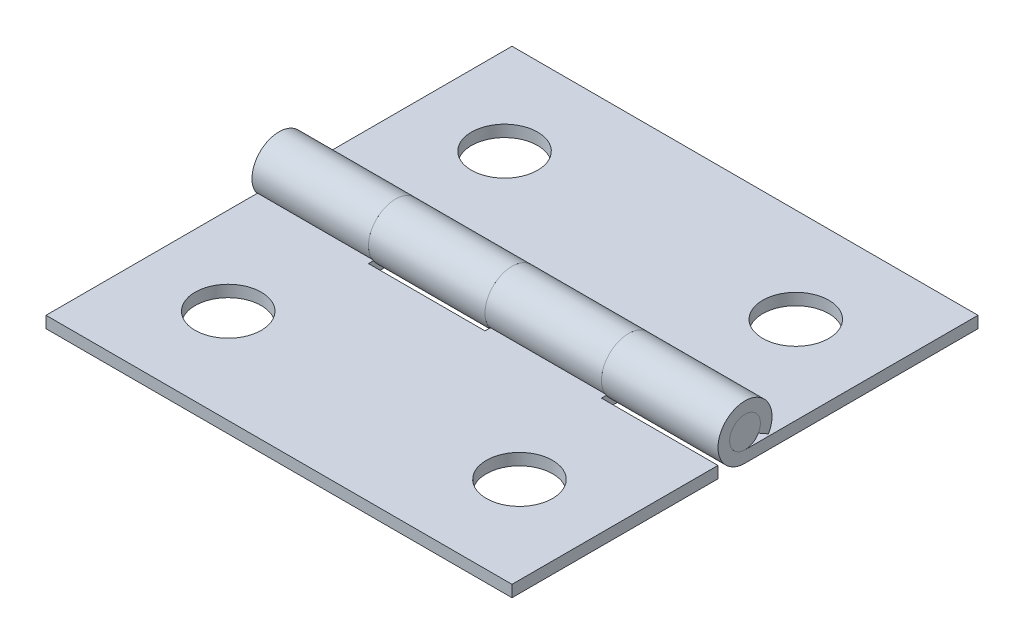
ISO-10303-21;
HEADER;
FILE_DESCRIPTION(('STEP AP214'),'2;1');
FILE_NAME('part.step','',(''),(''),'','','');
FILE_SCHEMA(('AUTOMOTIVE_DESIGN { 1 0 10303 214 1 1 1 1 }'));
ENDSEC;
DATA;
#1=APPLICATION_CONTEXT('core data for automotive mechanical design processes');
#2=APPLICATION_PROTOCOL_DEFINITION('international standard','automotive_design',2000,#1);
#3=PRODUCT_CONTEXT('',#1,'mechanical');
#4=PRODUCT('Part','Part','',(#3));
#5=PRODUCT_RELATED_PRODUCT_CATEGORY('part','',(#4));
#6=PRODUCT_DEFINITION_FORMATION('','',#4);
#7=PRODUCT_DEFINITION_CONTEXT('part definition',#1,'design');
#8=PRODUCT_DEFINITION('design','',#6,#7);
#9=PRODUCT_DEFINITION_SHAPE('','',#8);
#10=(LENGTH_UNIT() NAMED_UNIT(*) SI_UNIT(.MILLI.,.METRE.));
#11=(NAMED_UNIT(*) PLANE_ANGLE_UNIT() SI_UNIT($,.RADIAN.));
#12=(NAMED_UNIT(*) SI_UNIT($,.STERADIAN.) SOLID_ANGLE_UNIT());
#13=UNCERTAINTY_MEASURE_WITH_UNIT(LENGTH_MEASURE(1.E-05),#10,'distance_accuracy_value','');
#14=(GEOMETRIC_REPRESENTATION_CONTEXT(3) GLOBAL_UNCERTAINTY_ASSIGNED_CONTEXT((#13)) GLOBAL_UNIT_ASSIGNED_CONTEXT((#10,
#11,#12)) REPRESENTATION_CONTEXT('',''));
#15=CARTESIAN_POINT('',(0.,0.,0.));
#16=DIRECTION('',(0.,0.,1.));
#17=DIRECTION('',(1.,0.,0.));
#18=AXIS2_PLACEMENT_3D('',#15,#16,#17);
#19=CARTESIAN_POINT('',(12.7,0.,0.));
#20=DIRECTION('',(-1.,0.,0.));
#21=DIRECTION('',(0.,0.,1.));
#22=AXIS2_PLACEMENT_3D('',#19,#20,#21);
#23=CYLINDRICAL_SURFACE('',#22,0.8382);
#24=CARTESIAN_POINT('',(12.7,0.,0.));
#25=DIRECTION('',(1.,0.,0.));
#26=DIRECTION('',(0.,0.,-1.));
#27=AXIS2_PLACEMENT_3D('',#24,#25,#26);
#28=CIRCLE('',#27,0.8382);
#29=CARTESIAN_POINT('',(12.7,0.,-0.8382));
#30=VERTEX_POINT('',#29);
#31=EDGE_CURVE('E11',#30,#30,#28,.T.);
#32=ORIENTED_EDGE('',*,*,#31,.F.);
#33=EDGE_LOOP('',(#32));
#34=FACE_BOUND('',#33,.T.);
#35=CARTESIAN_POINT('',(-12.7,0.,0.));
#36=DIRECTION('',(1.,0.,0.));
#37=DIRECTION('',(0.,0.,-1.));
#38=AXIS2_PLACEMENT_3D('',#35,#36,#37);
#39=CIRCLE('',#38,0.8382);
#40=CARTESIAN_POINT('',(-12.7,0.,-0.8382));
#41=VERTEX_POINT('',#40);
#42=EDGE_CURVE('E54',#41,#41,#39,.T.);
#43=ORIENTED_EDGE('',*,*,#42,.T.);
#44=EDGE_LOOP('',(#43));
#45=FACE_BOUND('',#44,.T.);
#46=ADVANCED_FACE('F51',(#34,#45),#23,.T.);
#47=CARTESIAN_POINT('',(12.7,0.,0.));
#48=DIRECTION('',(1.,0.,0.));
#49=DIRECTION('',(0.,0.,-1.));
#50=AXIS2_PLACEMENT_3D('',#47,#48,#49);
#51=PLANE('',#50);
#52=ORIENTED_EDGE('',*,*,#31,.T.);
#53=EDGE_LOOP('',(#52));
#54=FACE_BOUND('',#53,.T.);
#55=ADVANCED_FACE('F66',(#54),#51,.T.);
#56=CARTESIAN_POINT('',(-12.7,0.,0.));
#57=DIRECTION('',(1.,0.,0.));
#58=DIRECTION('',(0.,0.,-1.));
#59=AXIS2_PLACEMENT_3D('',#56,#57,#58);
#60=PLANE('',#59);
#61=ORIENTED_EDGE('',*,*,#42,.F.);
#62=EDGE_LOOP('',(#61));
#63=FACE_BOUND('',#62,.T.);
#64=ADVANCED_FACE('F64',(#63),#60,.F.);
#65=CLOSED_SHELL('',(#46,#55,#64));
#66=MANIFOLD_SOLID_BREP('B2',#65);
#67=CARTESIAN_POINT('',(-12.7,0.,0.));
#68=DIRECTION('',(1.,0.,0.));
#69=DIRECTION('',(0.,0.,-1.));
#70=AXIS2_PLACEMENT_3D('',#67,#68,#69);
#71=CYLINDRICAL_SURFACE('',#70,1.47320000000008);
#72=CARTESIAN_POINT('',(-6.35,0.,0.));
#73=DIRECTION('',(1.,0.,0.));
#74=DIRECTION('',(0.,0.,-1.));
#75=AXIS2_PLACEMENT_3D('',#72,#73,#74);
#76=CIRCLE('',#75,1.47320000000008);
#77=CARTESIAN_POINT('',(-6.35,-0.728533124002552,-1.28045215733782));
#78=VERTEX_POINT('',#77);
#79=CARTESIAN_POINT('',(-6.35,-1.4732,0.));
#80=VERTEX_POINT('',#79);
#81=EDGE_CURVE('E245',#78,#80,#76,.T.);
#82=ORIENTED_EDGE('',*,*,#81,.T.);
#83=DIRECTION('',(1.,0.,0.));
#84=VECTOR('',#83,1.);
#85=CARTESIAN_POINT('',(-12.7,-1.4732,0.));
#86=LINE('',#85,#84);
#87=CARTESIAN_POINT('',(0.,-1.4732,0.));
#88=VERTEX_POINT('',#87);
#89=EDGE_CURVE('E226',#80,#88,#86,.T.);
#90=ORIENTED_EDGE('',*,*,#89,.T.);
#91=CARTESIAN_POINT('',(0.,0.,0.));
#92=DIRECTION('',(-1.,0.,0.));
#93=DIRECTION('',(0.,0.,1.));
#94=AXIS2_PLACEMENT_3D('',#91,#92,#93);
#95=CIRCLE('',#94,1.47320000000008);
#96=CARTESIAN_POINT('',(0.,-0.728533124002552,-1.28045215733782));
#97=VERTEX_POINT('',#96);
#98=EDGE_CURVE('E269',#88,#97,#95,.T.);
#99=ORIENTED_EDGE('',*,*,#98,.T.);
#100=DIRECTION('',(1.,0.,0.));
#101=VECTOR('',#100,1.);
#102=CARTESIAN_POINT('',(-12.7,-0.728533124002552,-1.28045215733782));
#103=LINE('',#102,#101);
#104=EDGE_CURVE('E306',#78,#97,#103,.T.);
#105=ORIENTED_EDGE('',*,*,#104,.F.);
#106=EDGE_LOOP('',(#82,#90,#99,#105));
#107=FACE_BOUND('',#106,.T.);
#108=ADVANCED_FACE('F106',(#107),#71,.T.);
#109=CARTESIAN_POINT('',(-12.7,0.,0.));
#110=DIRECTION('',(1.,0.,0.));
#111=DIRECTION('',(0.,0.,-1.));
#112=AXIS2_PLACEMENT_3D('',#109,#110,#111);
#113=CYLINDRICAL_SURFACE('',#112,0.8382);
#114=DIRECTION('',(1.,0.,0.));
#115=VECTOR('',#114,1.);
#116=CARTESIAN_POINT('',(-12.7,-0.8382,0.));
#117=LINE('',#116,#115);
#118=CARTESIAN_POINT('',(-6.35,-0.8382,0.));
#119=VERTEX_POINT('',#118);
#120=CARTESIAN_POINT('',(0.,-0.8382,0.));
#121=VERTEX_POINT('',#120);
#122=EDGE_CURVE('E317',#119,#121,#117,.T.);
#123=ORIENTED_EDGE('',*,*,#122,.F.);
#124=CARTESIAN_POINT('',(-6.35,0.,0.));
#125=DIRECTION('',(1.,0.,0.));
#126=DIRECTION('',(0.,0.,-1.));
#127=AXIS2_PLACEMENT_3D('',#124,#125,#126);
#128=CIRCLE('',#127,0.8382);
#129=CARTESIAN_POINT('',(-6.35,-0.41451022572559,-0.728533124002553));
#130=VERTEX_POINT('',#129);
#131=EDGE_CURVE('E239',#119,#130,#128,.F.);
#132=ORIENTED_EDGE('',*,*,#131,.T.);
#133=DIRECTION('',(1.,0.,0.));
#134=VECTOR('',#133,1.);
#135=CARTESIAN_POINT('',(-12.7,-0.41451022572559,-0.728533124002553));
#136=LINE('',#135,#134);
#137=CARTESIAN_POINT('',(0.,-0.41451022572559,-0.728533124002553));
#138=VERTEX_POINT('',#137);
#139=EDGE_CURVE('E303',#130,#138,#136,.T.);
#140=ORIENTED_EDGE('',*,*,#139,.T.);
#141=CARTESIAN_POINT('',(0.,0.,0.));
#142=DIRECTION('',(-1.,0.,0.));
#143=DIRECTION('',(0.,0.,1.));
#144=AXIS2_PLACEMENT_3D('',#141,#142,#143);
#145=CIRCLE('',#144,0.8382);
#146=EDGE_CURVE('E268',#138,#121,#145,.F.);
#147=ORIENTED_EDGE('',*,*,#146,.T.);
#148=EDGE_LOOP('',(#123,#132,#140,#147));
#149=FACE_BOUND('',#148,.T.);
#150=ADVANCED_FACE('F367',(#149),#113,.F.);
#151=CARTESIAN_POINT('',(-12.7,-0.41451022572559,-0.728533124002553));
#152=DIRECTION('',(0.,0.869163832024044,-0.494524249255059));
#153=DIRECTION('',(0.,-0.494524249255059,-0.869163832024044));
#154=AXIS2_PLACEMENT_3D('',#151,#152,#153);
#155=PLANE('',#154);
#156=ORIENTED_EDGE('',*,*,#139,.F.);
#157=DIRECTION('',(0.,-0.494524249255059,-0.869163832024044));
#158=VECTOR('',#157,1.);
#159=CARTESIAN_POINT('',(-6.35,-0.414510225725591,-0.728533124002555));
#160=LINE('',#159,#158);
#161=EDGE_CURVE('E242',#130,#78,#160,.T.);
#162=ORIENTED_EDGE('',*,*,#161,.T.);
#163=ORIENTED_EDGE('',*,*,#104,.T.);
#164=DIRECTION('',(0.,0.494524249255059,0.869163832024044));
#165=VECTOR('',#164,1.);
#166=CARTESIAN_POINT('',(0.,-0.414510225725592,-0.728533124002556));
#167=LINE('',#166,#165);
#168=EDGE_CURVE('E49',#97,#138,#167,.T.);
#169=ORIENTED_EDGE('',*,*,#168,.T.);
#170=EDGE_LOOP('',(#156,#162,#163,#169));
#171=FACE_BOUND('',#170,.T.);
#172=ADVANCED_FACE('F364',(#171),#155,.F.);
#173=CARTESIAN_POINT('',(6.35,-0.8382,0.));
#174=VERTEX_POINT('',#173);
#175=CARTESIAN_POINT('',(12.7,-0.8382,0.));
#176=VERTEX_POINT('',#175);
#177=EDGE_CURVE('E316',#174,#176,#117,.T.);
#178=ORIENTED_EDGE('',*,*,#177,.F.);
#179=CARTESIAN_POINT('',(6.35,0.,0.));
#180=DIRECTION('',(1.,0.,0.));
#181=DIRECTION('',(0.,0.,-1.));
#182=AXIS2_PLACEMENT_3D('',#179,#180,#181);
#183=CIRCLE('',#182,0.8382);
#184=CARTESIAN_POINT('',(6.35,-0.41451022572559,-0.728533124002553));
#185=VERTEX_POINT('',#184);
#186=EDGE_CURVE('E259',#174,#185,#183,.F.);
#187=ORIENTED_EDGE('',*,*,#186,.T.);
#188=CARTESIAN_POINT('',(12.7,-0.41451022572559,-0.728533124002553));
#189=VERTEX_POINT('',#188);
#190=EDGE_CURVE('E288',#185,#189,#136,.T.);
#191=ORIENTED_EDGE('',*,*,#190,.T.);
#192=CARTESIAN_POINT('',(12.7,0.,0.));
#193=DIRECTION('',(1.,0.,0.));
#194=DIRECTION('',(0.,0.,-1.));
#195=AXIS2_PLACEMENT_3D('',#192,#193,#194);
#196=CIRCLE('',#195,0.8382);
#197=EDGE_CURVE('E280',#189,#176,#196,.T.);
#198=ORIENTED_EDGE('',*,*,#197,.T.);
#199=EDGE_LOOP('',(#178,#187,#191,#198));
#200=FACE_BOUND('',#199,.T.);
#201=ADVANCED_FACE('F108',(#200),#113,.F.);
#202=CARTESIAN_POINT('',(-12.7,-0.838199999999992,-12.7));
#203=DIRECTION('',(0.,-1.,0.));
#204=DIRECTION('',(0.,0.,1.));
#205=AXIS2_PLACEMENT_3D('',#202,#203,#204);
#206=PLANE('',#205);
#207=CARTESIAN_POINT('',(-7.9502,-0.838199999999995,-7.5438));
#208=DIRECTION('',(0.,1.,0.));
#209=DIRECTION('',(0.,0.,-1.));
#210=AXIS2_PLACEMENT_3D('',#207,#208,#209);
#211=CIRCLE('',#210,1.8034);
#212=CARTESIAN_POINT('',(-7.9502,-0.838199999999994,-9.3472));
#213=VERTEX_POINT('',#212);
#214=EDGE_CURVE('E230',#213,#213,#211,.T.);
#215=ORIENTED_EDGE('',*,*,#214,.F.);
#216=EDGE_LOOP('',(#215));
#217=FACE_BOUND('',#216,.T.);
#218=CARTESIAN_POINT('',(7.9248,-0.838199999999995,-7.5438));
#219=DIRECTION('',(0.,1.,0.));
#220=DIRECTION('',(0.,0.,-1.));
#221=AXIS2_PLACEMENT_3D('',#218,#219,#220);
#222=CIRCLE('',#221,1.8034);
#223=CARTESIAN_POINT('',(7.9248,-0.838199999999994,-9.3472));
#224=VERTEX_POINT('',#223);
#225=EDGE_CURVE('E233',#224,#224,#222,.T.);
#226=ORIENTED_EDGE('',*,*,#225,.F.);
#227=EDGE_LOOP('',(#226));
#228=FACE_BOUND('',#227,.T.);
#229=DIRECTION('',(0.,0.,-1.));
#230=VECTOR('',#229,1.);
#231=CARTESIAN_POINT('',(-12.7,-0.838199999999992,-12.7));
#232=LINE('',#231,#230);
#233=CARTESIAN_POINT('',(-12.7,-0.838199999999999,-1.47320000000012));
#234=VERTEX_POINT('',#233);
#235=CARTESIAN_POINT('',(-12.7,-0.838199999999992,-12.7));
#236=VERTEX_POINT('',#235);
#237=EDGE_CURVE('E281',#234,#236,#232,.T.);
#238=ORIENTED_EDGE('',*,*,#237,.F.);
#239=DIRECTION('',(1.,0.,0.));
#240=VECTOR('',#239,1.);
#241=CARTESIAN_POINT('',(-12.7,-0.838199999999999,-1.47320000000012));
#242=LINE('',#241,#240);
#243=CARTESIAN_POINT('',(-6.35,-0.838199999999999,-1.47320000000012));
#244=VERTEX_POINT('',#243);
#245=EDGE_CURVE('E121',#234,#244,#242,.T.);
#246=ORIENTED_EDGE('',*,*,#245,.T.);
#247=DIRECTION('',(0.,0.,1.));
#248=VECTOR('',#247,1.);
#249=CARTESIAN_POINT('',(-6.35000000000001,-0.838199999999992,-12.7));
#250=LINE('',#249,#248);
#251=EDGE_CURVE('E214',#244,#119,#250,.T.);
#252=ORIENTED_EDGE('',*,*,#251,.T.);
#253=ORIENTED_EDGE('',*,*,#122,.T.);
#254=DIRECTION('',(0.,0.,-1.));
#255=VECTOR('',#254,1.);
#256=CARTESIAN_POINT('',(0.,-0.838199999999992,-12.7));
#257=LINE('',#256,#255);
#258=CARTESIAN_POINT('',(0.,-0.838199999999999,-1.47320000000012));
#259=VERTEX_POINT('',#258);
#260=EDGE_CURVE('E272',#121,#259,#257,.T.);
#261=ORIENTED_EDGE('',*,*,#260,.T.);
#262=DIRECTION('',(1.,0.,0.));
#263=VECTOR('',#262,1.);
#264=CARTESIAN_POINT('',(-12.7,-0.838199999999999,-1.47320000000012));
#265=LINE('',#264,#263);
#266=CARTESIAN_POINT('',(6.35,-0.838199999999999,-1.47320000000012));
#267=VERTEX_POINT('',#266);
#268=EDGE_CURVE('E277',#259,#267,#265,.T.);
#269=ORIENTED_EDGE('',*,*,#268,.T.);
#270=DIRECTION('',(0.,0.,1.));
#271=VECTOR('',#270,1.);
#272=CARTESIAN_POINT('',(6.34999999999999,-0.838199999999992,-12.7));
#273=LINE('',#272,#271);
#274=EDGE_CURVE('E263',#267,#174,#273,.T.);
#275=ORIENTED_EDGE('',*,*,#274,.T.);
#276=ORIENTED_EDGE('',*,*,#177,.T.);
#277=DIRECTION('',(0.,0.,-1.));
#278=VECTOR('',#277,1.);
#279=CARTESIAN_POINT('',(12.7,-0.838199999999992,-12.7));
#280=LINE('',#279,#278);
#281=CARTESIAN_POINT('',(12.7,-0.838199999999992,-12.7));
#282=VERTEX_POINT('',#281);
#283=EDGE_CURVE('E291',#176,#282,#280,.T.);
#284=ORIENTED_EDGE('',*,*,#283,.T.);
#285=DIRECTION('',(1.,0.,0.));
#286=VECTOR('',#285,1.);
#287=CARTESIAN_POINT('',(-12.7,-0.838199999999992,-12.7));
#288=LINE('',#287,#286);
#289=EDGE_CURVE('E313',#236,#282,#288,.T.);
#290=ORIENTED_EDGE('',*,*,#289,.F.);
#291=EDGE_LOOP('',(#238,#246,#252,#253,#261,#269,#275,#276,#284,#290));
#292=FACE_BOUND('',#291,.T.);
#293=ADVANCED_FACE('F338',(#217,#228,#292),#206,.F.);
#294=CARTESIAN_POINT('',(-12.7,-1.47319999999999,-12.7));
#295=DIRECTION('',(0.,0.,1.));
#296=DIRECTION('',(1.,0.,0.));
#297=AXIS2_PLACEMENT_3D('',#294,#295,#296);
#298=PLANE('',#297);
#299=DIRECTION('',(0.,-1.,0.));
#300=VECTOR('',#299,1.);
#301=CARTESIAN_POINT('',(12.7,-1.47319999999999,-12.7));
#302=LINE('',#301,#300);
#303=CARTESIAN_POINT('',(12.7,-1.47319999999999,-12.7));
#304=VERTEX_POINT('',#303);
#305=EDGE_CURVE('E293',#282,#304,#302,.T.);
#306=ORIENTED_EDGE('',*,*,#305,.T.);
#307=DIRECTION('',(1.,0.,0.));
#308=VECTOR('',#307,1.);
#309=CARTESIAN_POINT('',(-12.7,-1.47319999999999,-12.7));
#310=LINE('',#309,#308);
#311=CARTESIAN_POINT('',(-12.7,-1.47319999999999,-12.7));
#312=VERTEX_POINT('',#311);
#313=EDGE_CURVE('E310',#312,#304,#310,.T.);
#314=ORIENTED_EDGE('',*,*,#313,.F.);
#315=DIRECTION('',(0.,-1.,0.));
#316=VECTOR('',#315,1.);
#317=CARTESIAN_POINT('',(-12.7,-1.47319999999999,-12.7));
#318=LINE('',#317,#316);
#319=EDGE_CURVE('E283',#236,#312,#318,.T.);
#320=ORIENTED_EDGE('',*,*,#319,.F.);
#321=ORIENTED_EDGE('',*,*,#289,.T.);
#322=EDGE_LOOP('',(#306,#314,#320,#321));
#323=FACE_BOUND('',#322,.T.);
#324=ADVANCED_FACE('F351',(#323),#298,.F.);
#325=CARTESIAN_POINT('',(-12.7,-1.4732,0.));
#326=DIRECTION('',(0.,1.,0.));
#327=DIRECTION('',(0.,0.,-1.));
#328=AXIS2_PLACEMENT_3D('',#325,#326,#327);
#329=PLANE('',#328);
#330=CARTESIAN_POINT('',(-7.9502,-1.4732,-7.5438));
#331=DIRECTION('',(0.,1.,0.));
#332=DIRECTION('',(0.,0.,-1.));
#333=AXIS2_PLACEMENT_3D('',#330,#331,#332);
#334=CIRCLE('',#333,1.8034);
#335=CARTESIAN_POINT('',(-7.9502,-1.4732,-9.3472));
#336=VERTEX_POINT('',#335);
#337=EDGE_CURVE('E227',#336,#336,#334,.T.);
#338=ORIENTED_EDGE('',*,*,#337,.T.);
#339=EDGE_LOOP('',(#338));
#340=FACE_BOUND('',#339,.T.);
#341=CARTESIAN_POINT('',(7.9248,-1.4732,-7.5438));
#342=DIRECTION('',(0.,1.,0.));
#343=DIRECTION('',(0.,0.,-1.));
#344=AXIS2_PLACEMENT_3D('',#341,#342,#343);
#345=CIRCLE('',#344,1.8034);
#346=CARTESIAN_POINT('',(7.9248,-1.4732,-9.3472));
#347=VERTEX_POINT('',#346);
#348=EDGE_CURVE('E396',#347,#347,#345,.T.);
#349=ORIENTED_EDGE('',*,*,#348,.T.);
#350=EDGE_LOOP('',(#349));
#351=FACE_BOUND('',#350,.T.);
#352=DIRECTION('',(0.,0.,-1.));
#353=VECTOR('',#352,1.);
#354=CARTESIAN_POINT('',(-6.35,-1.4732,-1.47320000000012));
#355=LINE('',#354,#353);
#356=CARTESIAN_POINT('',(-6.35,-1.4732,-1.47320000000012));
#357=VERTEX_POINT('',#356);
#358=EDGE_CURVE('E211',#80,#357,#355,.T.);
#359=ORIENTED_EDGE('',*,*,#358,.T.);
#360=DIRECTION('',(-1.,0.,0.));
#361=VECTOR('',#360,1.);
#362=CARTESIAN_POINT('',(-12.7,-1.4732,-1.47320000000012));
#363=LINE('',#362,#361);
#364=CARTESIAN_POINT('',(-12.7,-1.4732,-1.47320000000012));
#365=VERTEX_POINT('',#364);
#366=EDGE_CURVE('E216',#357,#365,#363,.T.);
#367=ORIENTED_EDGE('',*,*,#366,.T.);
#368=DIRECTION('',(0.,0.,1.));
#369=VECTOR('',#368,1.);
#370=CARTESIAN_POINT('',(-12.7,-1.4732,0.));
#371=LINE('',#370,#369);
#372=EDGE_CURVE('E286',#312,#365,#371,.T.);
#373=ORIENTED_EDGE('',*,*,#372,.F.);
#374=ORIENTED_EDGE('',*,*,#313,.T.);
#375=DIRECTION('',(0.,0.,1.));
#376=VECTOR('',#375,1.);
#377=CARTESIAN_POINT('',(12.7,-1.4732,0.));
#378=LINE('',#377,#376);
#379=CARTESIAN_POINT('',(12.7,-1.4732,0.));
#380=VERTEX_POINT('',#379);
#381=EDGE_CURVE('E295',#304,#380,#378,.T.);
#382=ORIENTED_EDGE('',*,*,#381,.T.);
#383=CARTESIAN_POINT('',(6.35,-1.4732,0.));
#384=VERTEX_POINT('',#383);
#385=EDGE_CURVE('E308',#384,#380,#86,.T.);
#386=ORIENTED_EDGE('',*,*,#385,.F.);
#387=DIRECTION('',(0.,0.,-1.));
#388=VECTOR('',#387,1.);
#389=CARTESIAN_POINT('',(6.35,-1.4732,-1.47320000000012));
#390=LINE('',#389,#388);
#391=CARTESIAN_POINT('',(6.35,-1.4732,-1.47320000000012));
#392=VERTEX_POINT('',#391);
#393=EDGE_CURVE('E249',#384,#392,#390,.T.);
#394=ORIENTED_EDGE('',*,*,#393,.T.);
#395=DIRECTION('',(-1.,0.,0.));
#396=VECTOR('',#395,1.);
#397=CARTESIAN_POINT('',(0.,-1.4732,-1.47320000000012));
#398=LINE('',#397,#396);
#399=CARTESIAN_POINT('',(0.,-1.4732,-1.47320000000012));
#400=VERTEX_POINT('',#399);
#401=EDGE_CURVE('E252',#392,#400,#398,.T.);
#402=ORIENTED_EDGE('',*,*,#401,.T.);
#403=DIRECTION('',(0.,0.,1.));
#404=VECTOR('',#403,1.);
#405=CARTESIAN_POINT('',(0.,-1.4732,1.47320000000013));
#406=LINE('',#405,#404);
#407=EDGE_CURVE('E247',#400,#88,#406,.T.);
#408=ORIENTED_EDGE('',*,*,#407,.T.);
#409=ORIENTED_EDGE('',*,*,#89,.F.);
#410=EDGE_LOOP('',(#359,#367,#373,#374,#382,#386,#394,#402,#408,#409));
#411=FACE_BOUND('',#410,.T.);
#412=ADVANCED_FACE('F224',(#340,#351,#411),#329,.F.);
#413=CARTESIAN_POINT('',(6.35,-0.728533124002552,-1.28045215733782));
#414=VERTEX_POINT('',#413);
#415=CARTESIAN_POINT('',(12.7,-0.728533124002552,-1.28045215733782));
#416=VERTEX_POINT('',#415);
#417=EDGE_CURVE('E305',#414,#416,#103,.T.);
#418=ORIENTED_EDGE('',*,*,#417,.F.);
#419=CARTESIAN_POINT('',(6.35,0.,0.));
#420=DIRECTION('',(1.,0.,0.));
#421=DIRECTION('',(0.,0.,-1.));
#422=AXIS2_PLACEMENT_3D('',#419,#420,#421);
#423=CIRCLE('',#422,1.47320000000008);
#424=EDGE_CURVE('E129',#414,#384,#423,.T.);
#425=ORIENTED_EDGE('',*,*,#424,.T.);
#426=ORIENTED_EDGE('',*,*,#385,.T.);
#427=CARTESIAN_POINT('',(12.7,0.,0.));
#428=DIRECTION('',(-1.,0.,0.));
#429=DIRECTION('',(0.,0.,-1.));
#430=AXIS2_PLACEMENT_3D('',#427,#428,#429);
#431=CIRCLE('',#430,1.47320000000008);
#432=EDGE_CURVE('E298',#380,#416,#431,.T.);
#433=ORIENTED_EDGE('',*,*,#432,.T.);
#434=EDGE_LOOP('',(#418,#425,#426,#433));
#435=FACE_BOUND('',#434,.T.);
#436=ADVANCED_FACE('F323',(#435),#71,.T.);
#437=ORIENTED_EDGE('',*,*,#190,.F.);
#438=DIRECTION('',(0.,-0.494524249255059,-0.869163832024044));
#439=VECTOR('',#438,1.);
#440=CARTESIAN_POINT('',(6.35,-0.414510225725593,-0.728533124002558));
#441=LINE('',#440,#439);
#442=EDGE_CURVE('E114',#185,#414,#441,.T.);
#443=ORIENTED_EDGE('',*,*,#442,.T.);
#444=ORIENTED_EDGE('',*,*,#417,.T.);
#445=DIRECTION('',(0.,0.494524249255059,0.869163832024044));
#446=VECTOR('',#445,1.);
#447=CARTESIAN_POINT('',(12.7,-0.41451022572559,-0.728533124002553));
#448=LINE('',#447,#446);
#449=EDGE_CURVE('E284',#416,#189,#448,.T.);
#450=ORIENTED_EDGE('',*,*,#449,.T.);
#451=EDGE_LOOP('',(#437,#443,#444,#450));
#452=FACE_BOUND('',#451,.T.);
#453=ADVANCED_FACE('F321',(#452),#155,.F.);
#454=CARTESIAN_POINT('',(-12.7,0.,0.));
#455=DIRECTION('',(1.,0.,0.));
#456=DIRECTION('',(0.,0.,-1.));
#457=AXIS2_PLACEMENT_3D('',#454,#455,#456);
#458=PLANE('',#457);
#459=ORIENTED_EDGE('',*,*,#372,.T.);
#460=DIRECTION('',(0.,1.,0.));
#461=VECTOR('',#460,1.);
#462=CARTESIAN_POINT('',(-12.7,-1.4732,-1.47320000000012));
#463=LINE('',#462,#461);
#464=EDGE_CURVE('E215',#365,#234,#463,.T.);
#465=ORIENTED_EDGE('',*,*,#464,.T.);
#466=ORIENTED_EDGE('',*,*,#237,.T.);
#467=ORIENTED_EDGE('',*,*,#319,.T.);
#468=EDGE_LOOP('',(#459,#465,#466,#467));
#469=FACE_BOUND('',#468,.T.);
#470=ADVANCED_FACE('F355',(#469),#458,.F.);
#471=CARTESIAN_POINT('',(12.7,0.,0.));
#472=DIRECTION('',(1.,0.,0.));
#473=DIRECTION('',(0.,0.,-1.));
#474=AXIS2_PLACEMENT_3D('',#471,#472,#473);
#475=PLANE('',#474);
#476=ORIENTED_EDGE('',*,*,#197,.F.);
#477=ORIENTED_EDGE('',*,*,#449,.F.);
#478=ORIENTED_EDGE('',*,*,#432,.F.);
#479=ORIENTED_EDGE('',*,*,#381,.F.);
#480=ORIENTED_EDGE('',*,*,#305,.F.);
#481=ORIENTED_EDGE('',*,*,#283,.F.);
#482=EDGE_LOOP('',(#476,#477,#478,#479,#480,#481));
#483=FACE_BOUND('',#482,.T.);
#484=ADVANCED_FACE('F330',(#483),#475,.T.);
#485=CARTESIAN_POINT('',(0.,-1.4732,-1.47320000000012));
#486=DIRECTION('',(0.,0.,-1.));
#487=DIRECTION('',(-1.,0.,0.));
#488=AXIS2_PLACEMENT_3D('',#485,#486,#487);
#489=PLANE('',#488);
#490=DIRECTION('',(0.,1.,0.));
#491=VECTOR('',#490,1.);
#492=CARTESIAN_POINT('',(0.,-1.4732,-1.47320000000012));
#493=LINE('',#492,#491);
#494=EDGE_CURVE('E256',#400,#259,#493,.T.);
#495=ORIENTED_EDGE('',*,*,#494,.F.);
#496=ORIENTED_EDGE('',*,*,#401,.F.);
#497=DIRECTION('',(0.,1.,0.));
#498=VECTOR('',#497,1.);
#499=CARTESIAN_POINT('',(6.35,-1.4732,-1.47320000000012));
#500=LINE('',#499,#498);
#501=EDGE_CURVE('E255',#392,#267,#500,.T.);
#502=ORIENTED_EDGE('',*,*,#501,.T.);
#503=ORIENTED_EDGE('',*,*,#268,.F.);
#504=EDGE_LOOP('',(#495,#496,#502,#503));
#505=FACE_BOUND('',#504,.T.);
#506=ADVANCED_FACE('F341',(#505),#489,.F.);
#507=CARTESIAN_POINT('',(0.,-1.4732,1.47320000000013));
#508=DIRECTION('',(-1.,0.,0.));
#509=DIRECTION('',(0.,0.,1.));
#510=AXIS2_PLACEMENT_3D('',#507,#508,#509);
#511=PLANE('',#510);
#512=ORIENTED_EDGE('',*,*,#146,.F.);
#513=ORIENTED_EDGE('',*,*,#168,.F.);
#514=ORIENTED_EDGE('',*,*,#98,.F.);
#515=ORIENTED_EDGE('',*,*,#407,.F.);
#516=ORIENTED_EDGE('',*,*,#494,.T.);
#517=ORIENTED_EDGE('',*,*,#260,.F.);
#518=EDGE_LOOP('',(#512,#513,#514,#515,#516,#517));
#519=FACE_BOUND('',#518,.T.);
#520=ADVANCED_FACE('F346',(#519),#511,.F.);
#521=CARTESIAN_POINT('',(6.35,-1.4732,-1.47320000000012));
#522=DIRECTION('',(1.,0.,0.));
#523=DIRECTION('',(0.,0.,-1.));
#524=AXIS2_PLACEMENT_3D('',#521,#522,#523);
#525=PLANE('',#524);
#526=ORIENTED_EDGE('',*,*,#424,.F.);
#527=ORIENTED_EDGE('',*,*,#442,.F.);
#528=ORIENTED_EDGE('',*,*,#186,.F.);
#529=ORIENTED_EDGE('',*,*,#274,.F.);
#530=ORIENTED_EDGE('',*,*,#501,.F.);
#531=ORIENTED_EDGE('',*,*,#393,.F.);
#532=EDGE_LOOP('',(#526,#527,#528,#529,#530,#531));
#533=FACE_BOUND('',#532,.T.);
#534=ADVANCED_FACE('F335',(#533),#525,.F.);
#535=CARTESIAN_POINT('',(-6.35,-1.4732,-1.47320000000012));
#536=DIRECTION('',(1.,0.,0.));
#537=DIRECTION('',(0.,0.,-1.));
#538=AXIS2_PLACEMENT_3D('',#535,#536,#537);
#539=PLANE('',#538);
#540=ORIENTED_EDGE('',*,*,#81,.F.);
#541=ORIENTED_EDGE('',*,*,#161,.F.);
#542=ORIENTED_EDGE('',*,*,#131,.F.);
#543=ORIENTED_EDGE('',*,*,#251,.F.);
#544=DIRECTION('',(0.,1.,0.));
#545=VECTOR('',#544,1.);
#546=CARTESIAN_POINT('',(-6.35,-1.4732,-1.47320000000012));
#547=LINE('',#546,#545);
#548=EDGE_CURVE('E207',#357,#244,#547,.T.);
#549=ORIENTED_EDGE('',*,*,#548,.F.);
#550=ORIENTED_EDGE('',*,*,#358,.F.);
#551=EDGE_LOOP('',(#540,#541,#542,#543,#549,#550));
#552=FACE_BOUND('',#551,.T.);
#553=ADVANCED_FACE('F209',(#552),#539,.F.);
#554=CARTESIAN_POINT('',(-12.7,-1.4732,-1.47320000000012));
#555=DIRECTION('',(0.,0.,-1.));
#556=DIRECTION('',(-1.,0.,0.));
#557=AXIS2_PLACEMENT_3D('',#554,#555,#556);
#558=PLANE('',#557);
#559=ORIENTED_EDGE('',*,*,#464,.F.);
#560=ORIENTED_EDGE('',*,*,#366,.F.);
#561=ORIENTED_EDGE('',*,*,#548,.T.);
#562=ORIENTED_EDGE('',*,*,#245,.F.);
#563=EDGE_LOOP('',(#559,#560,#561,#562));
#564=FACE_BOUND('',#563,.T.);
#565=ADVANCED_FACE('F219',(#564),#558,.F.);
#566=CARTESIAN_POINT('',(7.9248,-1.4732,-7.5438));
#567=DIRECTION('',(0.,1.,0.));
#568=DIRECTION('',(0.,0.,-1.));
#569=AXIS2_PLACEMENT_3D('',#566,#567,#568);
#570=CYLINDRICAL_SURFACE('',#569,1.8034);
#571=ORIENTED_EDGE('',*,*,#348,.F.);
#572=EDGE_LOOP('',(#571));
#573=FACE_BOUND('',#572,.T.);
#574=ORIENTED_EDGE('',*,*,#225,.T.);
#575=EDGE_LOOP('',(#574));
#576=FACE_BOUND('',#575,.T.);
#577=ADVANCED_FACE('F403',(#573,#576),#570,.F.);
#578=CARTESIAN_POINT('',(-7.9502,-1.4732,-7.5438));
#579=DIRECTION('',(0.,1.,0.));
#580=DIRECTION('',(0.,0.,-1.));
#581=AXIS2_PLACEMENT_3D('',#578,#579,#580);
#582=CYLINDRICAL_SURFACE('',#581,1.8034);
#583=ORIENTED_EDGE('',*,*,#337,.F.);
#584=EDGE_LOOP('',(#583));
#585=FACE_BOUND('',#584,.T.);
#586=ORIENTED_EDGE('',*,*,#214,.T.);
#587=EDGE_LOOP('',(#586));
#588=FACE_BOUND('',#587,.T.);
#589=ADVANCED_FACE('F401',(#585,#588),#582,.F.);
#590=CLOSED_SHELL('',(#108,#150,#172,#201,#293,#324,#412,#436,#453,#470,#484,#506,#520,#534,
#553,#565,#577,#589));
#591=MANIFOLD_SOLID_BREP('B6',#590);
#592=CARTESIAN_POINT('',(12.7,0.,0.));
#593=DIRECTION('',(-1.,0.,0.));
#594=DIRECTION('',(0.,0.,1.));
#595=AXIS2_PLACEMENT_3D('',#592,#593,#594);
#596=CYLINDRICAL_SURFACE('',#595,1.47320000000008);
#597=CARTESIAN_POINT('',(6.35,0.,0.));
#598=DIRECTION('',(-1.,0.,0.));
#599=DIRECTION('',(0.,0.,1.));
#600=AXIS2_PLACEMENT_3D('',#597,#598,#599);
#601=CIRCLE('',#600,1.47320000000008);
#602=CARTESIAN_POINT('',(6.35,-0.728533124002553,1.28045215733782));
#603=VERTEX_POINT('',#602);
#604=CARTESIAN_POINT('',(6.35,-1.4732,0.));
#605=VERTEX_POINT('',#604);
#606=EDGE_CURVE('E699',#603,#605,#601,.T.);
#607=ORIENTED_EDGE('',*,*,#606,.T.);
#608=DIRECTION('',(-1.,0.,0.));
#609=VECTOR('',#608,1.);
#610=CARTESIAN_POINT('',(12.7,-1.4732,0.));
#611=LINE('',#610,#609);
#612=CARTESIAN_POINT('',(0.,-1.4732,0.));
#613=VERTEX_POINT('',#612);
#614=EDGE_CURVE('E680',#605,#613,#611,.T.);
#615=ORIENTED_EDGE('',*,*,#614,.T.);
#616=CARTESIAN_POINT('',(0.,0.,0.));
#617=DIRECTION('',(1.,0.,0.));
#618=DIRECTION('',(0.,0.,-1.));
#619=AXIS2_PLACEMENT_3D('',#616,#617,#618);
#620=CIRCLE('',#619,1.47320000000008);
#621=CARTESIAN_POINT('',(0.,-0.728533124002553,1.28045215733782));
#622=VERTEX_POINT('',#621);
#623=EDGE_CURVE('E723',#613,#622,#620,.T.);
#624=ORIENTED_EDGE('',*,*,#623,.T.);
#625=DIRECTION('',(-1.,0.,0.));
#626=VECTOR('',#625,1.);
#627=CARTESIAN_POINT('',(12.7,-0.728533124002553,1.28045215733782));
#628=LINE('',#627,#626);
#629=EDGE_CURVE('E760',#603,#622,#628,.T.);
#630=ORIENTED_EDGE('',*,*,#629,.F.);
#631=EDGE_LOOP('',(#607,#615,#624,#630));
#632=FACE_BOUND('',#631,.T.);
#633=ADVANCED_FACE('F560',(#632),#596,.T.);
#634=CARTESIAN_POINT('',(12.7,0.,0.));
#635=DIRECTION('',(-1.,0.,0.));
#636=DIRECTION('',(0.,0.,1.));
#637=AXIS2_PLACEMENT_3D('',#634,#635,#636);
#638=CYLINDRICAL_SURFACE('',#637,0.8382);
#639=DIRECTION('',(-1.,0.,0.));
#640=VECTOR('',#639,1.);
#641=CARTESIAN_POINT('',(12.7,-0.8382,0.));
#642=LINE('',#641,#640);
#643=CARTESIAN_POINT('',(6.35,-0.8382,0.));
#644=VERTEX_POINT('',#643);
#645=CARTESIAN_POINT('',(0.,-0.8382,0.));
#646=VERTEX_POINT('',#645);
#647=EDGE_CURVE('E771',#644,#646,#642,.T.);
#648=ORIENTED_EDGE('',*,*,#647,.F.);
#649=CARTESIAN_POINT('',(6.35,0.,0.));
#650=DIRECTION('',(-1.,0.,0.));
#651=DIRECTION('',(0.,0.,1.));
#652=AXIS2_PLACEMENT_3D('',#649,#650,#651);
#653=CIRCLE('',#652,0.8382);
#654=CARTESIAN_POINT('',(6.35,-0.414510225725591,0.728533124002553));
#655=VERTEX_POINT('',#654);
#656=EDGE_CURVE('E693',#644,#655,#653,.F.);
#657=ORIENTED_EDGE('',*,*,#656,.T.);
#658=DIRECTION('',(-1.,0.,0.));
#659=VECTOR('',#658,1.);
#660=CARTESIAN_POINT('',(12.7,-0.414510225725591,0.728533124002553));
#661=LINE('',#660,#659);
#662=CARTESIAN_POINT('',(0.,-0.414510225725591,0.728533124002553));
#663=VERTEX_POINT('',#662);
#664=EDGE_CURVE('E757',#655,#663,#661,.T.);
#665=ORIENTED_EDGE('',*,*,#664,.T.);
#666=CARTESIAN_POINT('',(0.,0.,0.));
#667=DIRECTION('',(1.,0.,0.));
#668=DIRECTION('',(0.,0.,-1.));
#669=AXIS2_PLACEMENT_3D('',#666,#667,#668);
#670=CIRCLE('',#669,0.8382);
#671=EDGE_CURVE('E722',#663,#646,#670,.F.);
#672=ORIENTED_EDGE('',*,*,#671,.T.);
#673=EDGE_LOOP('',(#648,#657,#665,#672));
#674=FACE_BOUND('',#673,.T.);
#675=ADVANCED_FACE('F821',(#674),#638,.F.);
#676=CARTESIAN_POINT('',(12.7,-0.414510225725591,0.728533124002553));
#677=DIRECTION('',(0.,0.869163832024044,0.494524249255059));
#678=DIRECTION('',(0.,-0.494524249255059,0.869163832024044));
#679=AXIS2_PLACEMENT_3D('',#676,#677,#678);
#680=PLANE('',#679);
#681=ORIENTED_EDGE('',*,*,#664,.F.);
#682=DIRECTION('',(0.,-0.494524249255059,0.869163832024044));
#683=VECTOR('',#682,1.);
#684=CARTESIAN_POINT('',(6.35,-0.414510225725592,0.728533124002555));
#685=LINE('',#684,#683);
#686=EDGE_CURVE('E696',#655,#603,#685,.T.);
#687=ORIENTED_EDGE('',*,*,#686,.T.);
#688=ORIENTED_EDGE('',*,*,#629,.T.);
#689=DIRECTION('',(0.,0.494524249255059,-0.869163832024044));
#690=VECTOR('',#689,1.);
#691=CARTESIAN_POINT('',(0.,-0.414510225725592,0.728533124002556));
#692=LINE('',#691,#690);
#693=EDGE_CURVE('E104',#622,#663,#692,.T.);
#694=ORIENTED_EDGE('',*,*,#693,.T.);
#695=EDGE_LOOP('',(#681,#687,#688,#694));
#696=FACE_BOUND('',#695,.T.);
#697=ADVANCED_FACE('F818',(#696),#680,.F.);
#698=CARTESIAN_POINT('',(-6.35,-0.8382,0.));
#699=VERTEX_POINT('',#698);
#700=CARTESIAN_POINT('',(-12.7,-0.8382,0.));
#701=VERTEX_POINT('',#700);
#702=EDGE_CURVE('E770',#699,#701,#642,.T.);
#703=ORIENTED_EDGE('',*,*,#702,.F.);
#704=CARTESIAN_POINT('',(-6.35,0.,0.));
#705=DIRECTION('',(-1.,0.,0.));
#706=DIRECTION('',(0.,0.,1.));
#707=AXIS2_PLACEMENT_3D('',#704,#705,#706);
#708=CIRCLE('',#707,0.8382);
#709=CARTESIAN_POINT('',(-6.35,-0.414510225725591,0.728533124002553));
#710=VERTEX_POINT('',#709);
#711=EDGE_CURVE('E713',#699,#710,#708,.F.);
#712=ORIENTED_EDGE('',*,*,#711,.T.);
#713=CARTESIAN_POINT('',(-12.7,-0.414510225725591,0.728533124002553));
#714=VERTEX_POINT('',#713);
#715=EDGE_CURVE('E742',#710,#714,#661,.T.);
#716=ORIENTED_EDGE('',*,*,#715,.T.);
#717=CARTESIAN_POINT('',(-12.7,0.,0.));
#718=DIRECTION('',(-1.,0.,0.));
#719=DIRECTION('',(0.,0.,1.));
#720=AXIS2_PLACEMENT_3D('',#717,#718,#719);
#721=CIRCLE('',#720,0.8382);
#722=EDGE_CURVE('E734',#714,#701,#721,.T.);
#723=ORIENTED_EDGE('',*,*,#722,.T.);
#724=EDGE_LOOP('',(#703,#712,#716,#723));
#725=FACE_BOUND('',#724,.T.);
#726=ADVANCED_FACE('F562',(#725),#638,.F.);
#727=CARTESIAN_POINT('',(12.7,-0.8382,12.7));
#728=DIRECTION('',(0.,-1.,0.));
#729=DIRECTION('',(0.,0.,-1.));
#730=AXIS2_PLACEMENT_3D('',#727,#728,#729);
#731=PLANE('',#730);
#732=CARTESIAN_POINT('',(7.9502,-0.8382,7.5438));
#733=DIRECTION('',(0.,1.,0.));
#734=DIRECTION('',(0.,0.,1.));
#735=AXIS2_PLACEMENT_3D('',#732,#733,#734);
#736=CIRCLE('',#735,1.8034);
#737=CARTESIAN_POINT('',(7.9502,-0.8382,9.3472));
#738=VERTEX_POINT('',#737);
#739=EDGE_CURVE('E684',#738,#738,#736,.T.);
#740=ORIENTED_EDGE('',*,*,#739,.F.);
#741=EDGE_LOOP('',(#740));
#742=FACE_BOUND('',#741,.T.);
#743=CARTESIAN_POINT('',(-7.9248,-0.8382,7.5438));
#744=DIRECTION('',(0.,1.,0.));
#745=DIRECTION('',(0.,0.,1.));
#746=AXIS2_PLACEMENT_3D('',#743,#744,#745);
#747=CIRCLE('',#746,1.8034);
#748=CARTESIAN_POINT('',(-7.9248,-0.8382,9.3472));
#749=VERTEX_POINT('',#748);
#750=EDGE_CURVE('E687',#749,#749,#747,.T.);
#751=ORIENTED_EDGE('',*,*,#750,.F.);
#752=EDGE_LOOP('',(#751));
#753=FACE_BOUND('',#752,.T.);
#754=DIRECTION('',(0.,0.,1.));
#755=VECTOR('',#754,1.);
#756=CARTESIAN_POINT('',(12.7,-0.8382,12.7));
#757=LINE('',#756,#755);
#758=CARTESIAN_POINT('',(12.7,-0.8382,1.47320000000012));
#759=VERTEX_POINT('',#758);
#760=CARTESIAN_POINT('',(12.7,-0.8382,12.7));
#761=VERTEX_POINT('',#760);
#762=EDGE_CURVE('E735',#759,#761,#757,.T.);
#763=ORIENTED_EDGE('',*,*,#762,.F.);
#764=DIRECTION('',(-1.,0.,0.));
#765=VECTOR('',#764,1.);
#766=CARTESIAN_POINT('',(12.7,-0.8382,1.47320000000012));
#767=LINE('',#766,#765);
#768=CARTESIAN_POINT('',(6.35,-0.8382,1.47320000000012));
#769=VERTEX_POINT('',#768);
#770=EDGE_CURVE('E575',#759,#769,#767,.T.);
#771=ORIENTED_EDGE('',*,*,#770,.T.);
#772=DIRECTION('',(0.,0.,-1.));
#773=VECTOR('',#772,1.);
#774=CARTESIAN_POINT('',(6.35000000000001,-0.8382,12.7));
#775=LINE('',#774,#773);
#776=EDGE_CURVE('E668',#769,#644,#775,.T.);
#777=ORIENTED_EDGE('',*,*,#776,.T.);
#778=ORIENTED_EDGE('',*,*,#647,.T.);
#779=DIRECTION('',(0.,0.,1.));
#780=VECTOR('',#779,1.);
#781=CARTESIAN_POINT('',(0.,-0.8382,12.7));
#782=LINE('',#781,#780);
#783=CARTESIAN_POINT('',(0.,-0.8382,1.47320000000012));
#784=VERTEX_POINT('',#783);
#785=EDGE_CURVE('E726',#646,#784,#782,.T.);
#786=ORIENTED_EDGE('',*,*,#785,.T.);
#787=DIRECTION('',(-1.,0.,0.));
#788=VECTOR('',#787,1.);
#789=CARTESIAN_POINT('',(12.7,-0.8382,1.47320000000012));
#790=LINE('',#789,#788);
#791=CARTESIAN_POINT('',(-6.35,-0.8382,1.47320000000012));
#792=VERTEX_POINT('',#791);
#793=EDGE_CURVE('E731',#784,#792,#790,.T.);
#794=ORIENTED_EDGE('',*,*,#793,.T.);
#795=DIRECTION('',(0.,0.,-1.));
#796=VECTOR('',#795,1.);
#797=CARTESIAN_POINT('',(-6.34999999999999,-0.8382,12.7));
#798=LINE('',#797,#796);
#799=EDGE_CURVE('E717',#792,#699,#798,.T.);
#800=ORIENTED_EDGE('',*,*,#799,.T.);
#801=ORIENTED_EDGE('',*,*,#702,.T.);
#802=DIRECTION('',(0.,0.,1.));
#803=VECTOR('',#802,1.);
#804=CARTESIAN_POINT('',(-12.7,-0.8382,12.7));
#805=LINE('',#804,#803);
#806=CARTESIAN_POINT('',(-12.7,-0.8382,12.7));
#807=VERTEX_POINT('',#806);
#808=EDGE_CURVE('E745',#701,#807,#805,.T.);
#809=ORIENTED_EDGE('',*,*,#808,.T.);
#810=DIRECTION('',(-1.,0.,0.));
#811=VECTOR('',#810,1.);
#812=CARTESIAN_POINT('',(12.7,-0.8382,12.7));
#813=LINE('',#812,#811);
#814=EDGE_CURVE('E767',#761,#807,#813,.T.);
#815=ORIENTED_EDGE('',*,*,#814,.F.);
#816=EDGE_LOOP('',(#763,#771,#777,#778,#786,#794,#800,#801,#809,#815));
#817=FACE_BOUND('',#816,.T.);
#818=ADVANCED_FACE('F792',(#742,#753,#817),#731,.F.);
#819=CARTESIAN_POINT('',(12.7,-1.4732,12.7));
#820=DIRECTION('',(0.,0.,-1.));
#821=DIRECTION('',(-1.,0.,0.));
#822=AXIS2_PLACEMENT_3D('',#819,#820,#821);
#823=PLANE('',#822);
#824=DIRECTION('',(0.,-1.,0.));
#825=VECTOR('',#824,1.);
#826=CARTESIAN_POINT('',(-12.7,-1.4732,12.7));
#827=LINE('',#826,#825);
#828=CARTESIAN_POINT('',(-12.7,-1.4732,12.7));
#829=VERTEX_POINT('',#828);
#830=EDGE_CURVE('E747',#807,#829,#827,.T.);
#831=ORIENTED_EDGE('',*,*,#830,.T.);
#832=DIRECTION('',(-1.,0.,0.));
#833=VECTOR('',#832,1.);
#834=CARTESIAN_POINT('',(12.7,-1.4732,12.7));
#835=LINE('',#834,#833);
#836=CARTESIAN_POINT('',(12.7,-1.4732,12.7));
#837=VERTEX_POINT('',#836);
#838=EDGE_CURVE('E764',#837,#829,#835,.T.);
#839=ORIENTED_EDGE('',*,*,#838,.F.);
#840=DIRECTION('',(0.,-1.,0.));
#841=VECTOR('',#840,1.);
#842=CARTESIAN_POINT('',(12.7,-1.4732,12.7));
#843=LINE('',#842,#841);
#844=EDGE_CURVE('E737',#761,#837,#843,.T.);
#845=ORIENTED_EDGE('',*,*,#844,.F.);
#846=ORIENTED_EDGE('',*,*,#814,.T.);
#847=EDGE_LOOP('',(#831,#839,#845,#846));
#848=FACE_BOUND('',#847,.T.);
#849=ADVANCED_FACE('F805',(#848),#823,.F.);
#850=CARTESIAN_POINT('',(12.7,-1.4732,0.));
#851=DIRECTION('',(0.,1.,0.));
#852=DIRECTION('',(0.,0.,1.));
#853=AXIS2_PLACEMENT_3D('',#850,#851,#852);
#854=PLANE('',#853);
#855=CARTESIAN_POINT('',(7.9502,-1.4732,7.5438));
#856=DIRECTION('',(0.,1.,0.));
#857=DIRECTION('',(0.,0.,1.));
#858=AXIS2_PLACEMENT_3D('',#855,#856,#857);
#859=CIRCLE('',#858,1.8034);
#860=CARTESIAN_POINT('',(7.9502,-1.4732,9.3472));
#861=VERTEX_POINT('',#860);
#862=EDGE_CURVE('E681',#861,#861,#859,.T.);
#863=ORIENTED_EDGE('',*,*,#862,.T.);
#864=EDGE_LOOP('',(#863));
#865=FACE_BOUND('',#864,.T.);
#866=CARTESIAN_POINT('',(-7.9248,-1.4732,7.5438));
#867=DIRECTION('',(0.,1.,0.));
#868=DIRECTION('',(0.,0.,1.));
#869=AXIS2_PLACEMENT_3D('',#866,#867,#868);
#870=CIRCLE('',#869,1.8034);
#871=CARTESIAN_POINT('',(-7.9248,-1.4732,9.3472));
#872=VERTEX_POINT('',#871);
#873=EDGE_CURVE('E850',#872,#872,#870,.T.);
#874=ORIENTED_EDGE('',*,*,#873,.T.);
#875=EDGE_LOOP('',(#874));
#876=FACE_BOUND('',#875,.T.);
#877=DIRECTION('',(0.,0.,1.));
#878=VECTOR('',#877,1.);
#879=CARTESIAN_POINT('',(6.35,-1.4732,1.47320000000012));
#880=LINE('',#879,#878);
#881=CARTESIAN_POINT('',(6.35,-1.4732,1.47320000000012));
#882=VERTEX_POINT('',#881);
#883=EDGE_CURVE('E665',#605,#882,#880,.T.);
#884=ORIENTED_EDGE('',*,*,#883,.T.);
#885=DIRECTION('',(1.,0.,0.));
#886=VECTOR('',#885,1.);
#887=CARTESIAN_POINT('',(12.7,-1.4732,1.47320000000012));
#888=LINE('',#887,#886);
#889=CARTESIAN_POINT('',(12.7,-1.4732,1.47320000000012));
#890=VERTEX_POINT('',#889);
#891=EDGE_CURVE('E670',#882,#890,#888,.T.);
#892=ORIENTED_EDGE('',*,*,#891,.T.);
#893=DIRECTION('',(0.,0.,-1.));
#894=VECTOR('',#893,1.);
#895=CARTESIAN_POINT('',(12.7,-1.4732,0.));
#896=LINE('',#895,#894);
#897=EDGE_CURVE('E740',#837,#890,#896,.T.);
#898=ORIENTED_EDGE('',*,*,#897,.F.);
#899=ORIENTED_EDGE('',*,*,#838,.T.);
#900=DIRECTION('',(0.,0.,-1.));
#901=VECTOR('',#900,1.);
#902=CARTESIAN_POINT('',(-12.7,-1.4732,0.));
#903=LINE('',#902,#901);
#904=CARTESIAN_POINT('',(-12.7,-1.4732,0.));
#905=VERTEX_POINT('',#904);
#906=EDGE_CURVE('E749',#829,#905,#903,.T.);
#907=ORIENTED_EDGE('',*,*,#906,.T.);
#908=CARTESIAN_POINT('',(-6.35,-1.4732,0.));
#909=VERTEX_POINT('',#908);
#910=EDGE_CURVE('E762',#909,#905,#611,.T.);
#911=ORIENTED_EDGE('',*,*,#910,.F.);
#912=DIRECTION('',(0.,0.,1.));
#913=VECTOR('',#912,1.);
#914=CARTESIAN_POINT('',(-6.35,-1.4732,1.47320000000012));
#915=LINE('',#914,#913);
#916=CARTESIAN_POINT('',(-6.35,-1.4732,1.47320000000012));
#917=VERTEX_POINT('',#916);
#918=EDGE_CURVE('E703',#909,#917,#915,.T.);
#919=ORIENTED_EDGE('',*,*,#918,.T.);
#920=DIRECTION('',(1.,0.,0.));
#921=VECTOR('',#920,1.);
#922=CARTESIAN_POINT('',(0.,-1.4732,1.47320000000012));
#923=LINE('',#922,#921);
#924=CARTESIAN_POINT('',(0.,-1.4732,1.47320000000012));
#925=VERTEX_POINT('',#924);
#926=EDGE_CURVE('E706',#917,#925,#923,.T.);
#927=ORIENTED_EDGE('',*,*,#926,.T.);
#928=DIRECTION('',(0.,0.,-1.));
#929=VECTOR('',#928,1.);
#930=CARTESIAN_POINT('',(0.,-1.4732,-1.47320000000013));
#931=LINE('',#930,#929);
#932=EDGE_CURVE('E701',#925,#613,#931,.T.);
#933=ORIENTED_EDGE('',*,*,#932,.T.);
#934=ORIENTED_EDGE('',*,*,#614,.F.);
#935=EDGE_LOOP('',(#884,#892,#898,#899,#907,#911,#919,#927,#933,#934));
#936=FACE_BOUND('',#935,.T.);
#937=ADVANCED_FACE('F678',(#865,#876,#936),#854,.F.);
#938=CARTESIAN_POINT('',(-6.35,-0.728533124002553,1.28045215733782));
#939=VERTEX_POINT('',#938);
#940=CARTESIAN_POINT('',(-12.7,-0.728533124002553,1.28045215733782));
#941=VERTEX_POINT('',#940);
#942=EDGE_CURVE('E759',#939,#941,#628,.T.);
#943=ORIENTED_EDGE('',*,*,#942,.F.);
#944=CARTESIAN_POINT('',(-6.35,0.,0.));
#945=DIRECTION('',(-1.,0.,0.));
#946=DIRECTION('',(0.,0.,1.));
#947=AXIS2_PLACEMENT_3D('',#944,#945,#946);
#948=CIRCLE('',#947,1.47320000000008);
#949=EDGE_CURVE('E583',#939,#909,#948,.T.);
#950=ORIENTED_EDGE('',*,*,#949,.T.);
#951=ORIENTED_EDGE('',*,*,#910,.T.);
#952=CARTESIAN_POINT('',(-12.7,0.,0.));
#953=DIRECTION('',(1.,0.,0.));
#954=DIRECTION('',(0.,0.,1.));
#955=AXIS2_PLACEMENT_3D('',#952,#953,#954);
#956=CIRCLE('',#955,1.47320000000008);
#957=EDGE_CURVE('E752',#905,#941,#956,.T.);
#958=ORIENTED_EDGE('',*,*,#957,.T.);
#959=EDGE_LOOP('',(#943,#950,#951,#958));
#960=FACE_BOUND('',#959,.T.);
#961=ADVANCED_FACE('F777',(#960),#596,.T.);
#962=ORIENTED_EDGE('',*,*,#715,.F.);
#963=DIRECTION('',(0.,-0.494524249255059,0.869163832024044));
#964=VECTOR('',#963,1.);
#965=CARTESIAN_POINT('',(-6.35,-0.414510225725593,0.728533124002557));
#966=LINE('',#965,#964);
#967=EDGE_CURVE('E568',#710,#939,#966,.T.);
#968=ORIENTED_EDGE('',*,*,#967,.T.);
#969=ORIENTED_EDGE('',*,*,#942,.T.);
#970=DIRECTION('',(0.,0.494524249255059,-0.869163832024044));
#971=VECTOR('',#970,1.);
#972=CARTESIAN_POINT('',(-12.7,-0.414510225725591,0.728533124002553));
#973=LINE('',#972,#971);
#974=EDGE_CURVE('E738',#941,#714,#973,.T.);
#975=ORIENTED_EDGE('',*,*,#974,.T.);
#976=EDGE_LOOP('',(#962,#968,#969,#975));
#977=FACE_BOUND('',#976,.T.);
#978=ADVANCED_FACE('F775',(#977),#680,.F.);
#979=CARTESIAN_POINT('',(12.7,0.,0.));
#980=DIRECTION('',(-1.,0.,0.));
#981=DIRECTION('',(0.,0.,1.));
#982=AXIS2_PLACEMENT_3D('',#979,#980,#981);
#983=PLANE('',#982);
#984=ORIENTED_EDGE('',*,*,#897,.T.);
#985=DIRECTION('',(0.,1.,0.));
#986=VECTOR('',#985,1.);
#987=CARTESIAN_POINT('',(12.7,-1.4732,1.47320000000012));
#988=LINE('',#987,#986);
#989=EDGE_CURVE('E669',#890,#759,#988,.T.);
#990=ORIENTED_EDGE('',*,*,#989,.T.);
#991=ORIENTED_EDGE('',*,*,#762,.T.);
#992=ORIENTED_EDGE('',*,*,#844,.T.);
#993=EDGE_LOOP('',(#984,#990,#991,#992));
#994=FACE_BOUND('',#993,.T.);
#995=ADVANCED_FACE('F809',(#994),#983,.F.);
#996=CARTESIAN_POINT('',(-12.7,0.,0.));
#997=DIRECTION('',(-1.,0.,0.));
#998=DIRECTION('',(0.,0.,1.));
#999=AXIS2_PLACEMENT_3D('',#996,#997,#998);
#1000=PLANE('',#999);
#1001=ORIENTED_EDGE('',*,*,#722,.F.);
#1002=ORIENTED_EDGE('',*,*,#974,.F.);
#1003=ORIENTED_EDGE('',*,*,#957,.F.);
#1004=ORIENTED_EDGE('',*,*,#906,.F.);
#1005=ORIENTED_EDGE('',*,*,#830,.F.);
#1006=ORIENTED_EDGE('',*,*,#808,.F.);
#1007=EDGE_LOOP('',(#1001,#1002,#1003,#1004,#1005,#1006));
#1008=FACE_BOUND('',#1007,.T.);
#1009=ADVANCED_FACE('F784',(#1008),#1000,.T.);
#1010=CARTESIAN_POINT('',(0.,-1.4732,1.47320000000012));
#1011=DIRECTION('',(0.,0.,1.));
#1012=DIRECTION('',(1.,0.,0.));
#1013=AXIS2_PLACEMENT_3D('',#1010,#1011,#1012);
#1014=PLANE('',#1013);
#1015=DIRECTION('',(0.,1.,0.));
#1016=VECTOR('',#1015,1.);
#1017=CARTESIAN_POINT('',(0.,-1.4732,1.47320000000012));
#1018=LINE('',#1017,#1016);
#1019=EDGE_CURVE('E710',#925,#784,#1018,.T.);
#1020=ORIENTED_EDGE('',*,*,#1019,.F.);
#1021=ORIENTED_EDGE('',*,*,#926,.F.);
#1022=DIRECTION('',(0.,1.,0.));
#1023=VECTOR('',#1022,1.);
#1024=CARTESIAN_POINT('',(-6.35,-1.4732,1.47320000000012));
#1025=LINE('',#1024,#1023);
#1026=EDGE_CURVE('E709',#917,#792,#1025,.T.);
#1027=ORIENTED_EDGE('',*,*,#1026,.T.);
#1028=ORIENTED_EDGE('',*,*,#793,.F.);
#1029=EDGE_LOOP('',(#1020,#1021,#1027,#1028));
#1030=FACE_BOUND('',#1029,.T.);
#1031=ADVANCED_FACE('F795',(#1030),#1014,.F.);
#1032=CARTESIAN_POINT('',(0.,-1.4732,-1.47320000000013));
#1033=DIRECTION('',(1.,0.,0.));
#1034=DIRECTION('',(0.,0.,-1.));
#1035=AXIS2_PLACEMENT_3D('',#1032,#1033,#1034);
#1036=PLANE('',#1035);
#1037=ORIENTED_EDGE('',*,*,#671,.F.);
#1038=ORIENTED_EDGE('',*,*,#693,.F.);
#1039=ORIENTED_EDGE('',*,*,#623,.F.);
#1040=ORIENTED_EDGE('',*,*,#932,.F.);
#1041=ORIENTED_EDGE('',*,*,#1019,.T.);
#1042=ORIENTED_EDGE('',*,*,#785,.F.);
#1043=EDGE_LOOP('',(#1037,#1038,#1039,#1040,#1041,#1042));
#1044=FACE_BOUND('',#1043,.T.);
#1045=ADVANCED_FACE('F800',(#1044),#1036,.F.);
#1046=CARTESIAN_POINT('',(-6.35,-1.4732,1.47320000000012));
#1047=DIRECTION('',(-1.,0.,0.));
#1048=DIRECTION('',(0.,0.,1.));
#1049=AXIS2_PLACEMENT_3D('',#1046,#1047,#1048);
#1050=PLANE('',#1049);
#1051=ORIENTED_EDGE('',*,*,#949,.F.);
#1052=ORIENTED_EDGE('',*,*,#967,.F.);
#1053=ORIENTED_EDGE('',*,*,#711,.F.);
#1054=ORIENTED_EDGE('',*,*,#799,.F.);
#1055=ORIENTED_EDGE('',*,*,#1026,.F.);
#1056=ORIENTED_EDGE('',*,*,#918,.F.);
#1057=EDGE_LOOP('',(#1051,#1052,#1053,#1054,#1055,#1056));
#1058=FACE_BOUND('',#1057,.T.);
#1059=ADVANCED_FACE('F789',(#1058),#1050,.F.);
#1060=CARTESIAN_POINT('',(6.35,-1.4732,1.47320000000012));
#1061=DIRECTION('',(-1.,0.,0.));
#1062=DIRECTION('',(0.,0.,1.));
#1063=AXIS2_PLACEMENT_3D('',#1060,#1061,#1062);
#1064=PLANE('',#1063);
#1065=ORIENTED_EDGE('',*,*,#606,.F.);
#1066=ORIENTED_EDGE('',*,*,#686,.F.);
#1067=ORIENTED_EDGE('',*,*,#656,.F.);
#1068=ORIENTED_EDGE('',*,*,#776,.F.);
#1069=DIRECTION('',(0.,1.,0.));
#1070=VECTOR('',#1069,1.);
#1071=CARTESIAN_POINT('',(6.35,-1.4732,1.47320000000012));
#1072=LINE('',#1071,#1070);
#1073=EDGE_CURVE('E661',#882,#769,#1072,.T.);
#1074=ORIENTED_EDGE('',*,*,#1073,.F.);
#1075=ORIENTED_EDGE('',*,*,#883,.F.);
#1076=EDGE_LOOP('',(#1065,#1066,#1067,#1068,#1074,#1075));
#1077=FACE_BOUND('',#1076,.T.);
#1078=ADVANCED_FACE('F663',(#1077),#1064,.F.);
#1079=CARTESIAN_POINT('',(12.7,-1.4732,1.47320000000012));
#1080=DIRECTION('',(0.,0.,1.));
#1081=DIRECTION('',(1.,0.,0.));
#1082=AXIS2_PLACEMENT_3D('',#1079,#1080,#1081);
#1083=PLANE('',#1082);
#1084=ORIENTED_EDGE('',*,*,#989,.F.);
#1085=ORIENTED_EDGE('',*,*,#891,.F.);
#1086=ORIENTED_EDGE('',*,*,#1073,.T.);
#1087=ORIENTED_EDGE('',*,*,#770,.F.);
#1088=EDGE_LOOP('',(#1084,#1085,#1086,#1087));
#1089=FACE_BOUND('',#1088,.T.);
#1090=ADVANCED_FACE('F673',(#1089),#1083,.F.);
#1091=CARTESIAN_POINT('',(-7.9248,-1.4732,7.5438));
#1092=DIRECTION('',(0.,1.,0.));
#1093=DIRECTION('',(0.,0.,1.));
#1094=AXIS2_PLACEMENT_3D('',#1091,#1092,#1093);
#1095=CYLINDRICAL_SURFACE('',#1094,1.8034);
#1096=ORIENTED_EDGE('',*,*,#873,.F.);
#1097=EDGE_LOOP('',(#1096));
#1098=FACE_BOUND('',#1097,.T.);
#1099=ORIENTED_EDGE('',*,*,#750,.T.);
#1100=EDGE_LOOP('',(#1099));
#1101=FACE_BOUND('',#1100,.T.);
#1102=ADVANCED_FACE('F857',(#1098,#1101),#1095,.F.);
#1103=CARTESIAN_POINT('',(7.9502,-1.4732,7.5438));
#1104=DIRECTION('',(0.,1.,0.));
#1105=DIRECTION('',(0.,0.,1.));
#1106=AXIS2_PLACEMENT_3D('',#1103,#1104,#1105);
#1107=CYLINDRICAL_SURFACE('',#1106,1.8034);
#1108=ORIENTED_EDGE('',*,*,#862,.F.);
#1109=EDGE_LOOP('',(#1108));
#1110=FACE_BOUND('',#1109,.T.);
#1111=ORIENTED_EDGE('',*,*,#739,.T.);
#1112=EDGE_LOOP('',(#1111));
#1113=FACE_BOUND('',#1112,.T.);
#1114=ADVANCED_FACE('F855',(#1110,#1113),#1107,.F.);
#1115=CLOSED_SHELL('',(#633,#675,#697,#726,#818,#849,#937,#961,#978,#995,#1009,#1031,#1045,
#1059,#1078,#1090,#1102,#1114));
#1116=MANIFOLD_SOLID_BREP('B43',#1115);
#1117=ADVANCED_BREP_SHAPE_REPRESENTATION('',(#18,#66,#591,#1116),#14);
#1118=SHAPE_DEFINITION_REPRESENTATION(#9,#1117);
ENDSEC;
END-ISO-10303-21;
